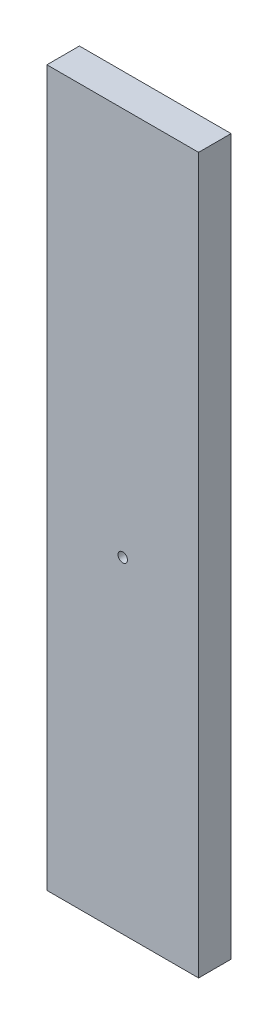
ISO-10303-21;
HEADER;
FILE_DESCRIPTION(('STEP AP214'),'2;1');
FILE_NAME('part.step','',(''),(''),'','','');
FILE_SCHEMA(('AUTOMOTIVE_DESIGN { 1 0 10303 214 1 1 1 1 }'));
ENDSEC;
DATA;
#1=APPLICATION_CONTEXT('core data for automotive mechanical design processes');
#2=APPLICATION_PROTOCOL_DEFINITION('international standard','automotive_design',2000,#1);
#3=PRODUCT_CONTEXT('',#1,'mechanical');
#4=PRODUCT('Part','Part','',(#3));
#5=PRODUCT_RELATED_PRODUCT_CATEGORY('part','',(#4));
#6=PRODUCT_DEFINITION_FORMATION('','',#4);
#7=PRODUCT_DEFINITION_CONTEXT('part definition',#1,'design');
#8=PRODUCT_DEFINITION('design','',#6,#7);
#9=PRODUCT_DEFINITION_SHAPE('','',#8);
#10=(LENGTH_UNIT() NAMED_UNIT(*) SI_UNIT(.MILLI.,.METRE.));
#11=(NAMED_UNIT(*) PLANE_ANGLE_UNIT() SI_UNIT($,.RADIAN.));
#12=(NAMED_UNIT(*) SI_UNIT($,.STERADIAN.) SOLID_ANGLE_UNIT());
#13=UNCERTAINTY_MEASURE_WITH_UNIT(LENGTH_MEASURE(1.E-05),#10,'distance_accuracy_value','');
#14=(GEOMETRIC_REPRESENTATION_CONTEXT(3) GLOBAL_UNCERTAINTY_ASSIGNED_CONTEXT((#13)) GLOBAL_UNIT_ASSIGNED_CONTEXT((#10,
#11,#12)) REPRESENTATION_CONTEXT('',''));
#15=CARTESIAN_POINT('',(0.,0.,0.));
#16=DIRECTION('',(0.,0.,1.));
#17=DIRECTION('',(1.,0.,0.));
#18=AXIS2_PLACEMENT_3D('',#15,#16,#17);
#19=CARTESIAN_POINT('',(0.,419.1,0.));
#20=DIRECTION('',(1.,0.,0.));
#21=DIRECTION('',(0.,0.,-1.));
#22=AXIS2_PLACEMENT_3D('',#19,#20,#21);
#23=PLANE('',#22);
#24=DIRECTION('',(0.,0.,1.));
#25=VECTOR('',#24,1.);
#26=CARTESIAN_POINT('',(0.,0.,0.));
#27=LINE('',#26,#25);
#28=CARTESIAN_POINT('',(0.,0.,-19.05));
#29=VERTEX_POINT('',#28);
#30=CARTESIAN_POINT('',(0.,0.,0.));
#31=VERTEX_POINT('',#30);
#32=EDGE_CURVE('E102',#29,#31,#27,.T.);
#33=ORIENTED_EDGE('',*,*,#32,.T.);
#34=DIRECTION('',(0.,-1.,0.));
#35=VECTOR('',#34,1.);
#36=CARTESIAN_POINT('',(0.,419.1,0.));
#37=LINE('',#36,#35);
#38=CARTESIAN_POINT('',(0.,419.1,0.));
#39=VERTEX_POINT('',#38);
#40=EDGE_CURVE('E11',#39,#31,#37,.T.);
#41=ORIENTED_EDGE('',*,*,#40,.F.);
#42=DIRECTION('',(0.,0.,1.));
#43=VECTOR('',#42,1.);
#44=CARTESIAN_POINT('',(0.,419.1,0.));
#45=LINE('',#44,#43);
#46=CARTESIAN_POINT('',(0.,419.1,-19.05));
#47=VERTEX_POINT('',#46);
#48=EDGE_CURVE('E90',#47,#39,#45,.T.);
#49=ORIENTED_EDGE('',*,*,#48,.F.);
#50=DIRECTION('',(0.,-1.,0.));
#51=VECTOR('',#50,1.);
#52=CARTESIAN_POINT('',(0.,419.1,-19.05));
#53=LINE('',#52,#51);
#54=EDGE_CURVE('E98',#47,#29,#53,.T.);
#55=ORIENTED_EDGE('',*,*,#54,.T.);
#56=EDGE_LOOP('',(#33,#41,#49,#55));
#57=FACE_BOUND('',#56,.T.);
#58=ADVANCED_FACE('F39',(#57),#23,.F.);
#59=CARTESIAN_POINT('',(0.,419.1,0.));
#60=DIRECTION('',(0.,0.,-1.));
#61=DIRECTION('',(-1.,0.,0.));
#62=AXIS2_PLACEMENT_3D('',#59,#60,#61);
#63=PLANE('',#62);
#64=CARTESIAN_POINT('',(44.45,191.301352372526,0.));
#65=DIRECTION('',(0.,0.,1.));
#66=DIRECTION('',(1.,0.,0.));
#67=AXIS2_PLACEMENT_3D('',#64,#65,#66);
#68=CIRCLE('',#67,2.77812500000003);
#69=CARTESIAN_POINT('',(47.228125,191.301352372526,0.));
#70=VERTEX_POINT('',#69);
#71=EDGE_CURVE('E116',#70,#70,#68,.T.);
#72=ORIENTED_EDGE('',*,*,#71,.F.);
#73=EDGE_LOOP('',(#72));
#74=FACE_BOUND('',#73,.T.);
#75=DIRECTION('',(1.,0.,0.));
#76=VECTOR('',#75,1.);
#77=CARTESIAN_POINT('',(0.,0.,0.));
#78=LINE('',#77,#76);
#79=CARTESIAN_POINT('',(88.9,0.,0.));
#80=VERTEX_POINT('',#79);
#81=EDGE_CURVE('E94',#31,#80,#78,.T.);
#82=ORIENTED_EDGE('',*,*,#81,.T.);
#83=DIRECTION('',(0.,-1.,0.));
#84=VECTOR('',#83,1.);
#85=CARTESIAN_POINT('',(88.9,419.1,0.));
#86=LINE('',#85,#84);
#87=CARTESIAN_POINT('',(88.9,419.1,0.));
#88=VERTEX_POINT('',#87);
#89=EDGE_CURVE('E47',#88,#80,#86,.T.);
#90=ORIENTED_EDGE('',*,*,#89,.F.);
#91=DIRECTION('',(1.,0.,0.));
#92=VECTOR('',#91,1.);
#93=CARTESIAN_POINT('',(0.,419.1,0.));
#94=LINE('',#93,#92);
#95=EDGE_CURVE('E85',#39,#88,#94,.T.);
#96=ORIENTED_EDGE('',*,*,#95,.F.);
#97=ORIENTED_EDGE('',*,*,#40,.T.);
#98=EDGE_LOOP('',(#82,#90,#96,#97));
#99=FACE_BOUND('',#98,.T.);
#100=ADVANCED_FACE('F93',(#74,#99),#63,.F.);
#101=CARTESIAN_POINT('',(88.9,419.1,0.));
#102=DIRECTION('',(-1.,0.,0.));
#103=DIRECTION('',(0.,0.,1.));
#104=AXIS2_PLACEMENT_3D('',#101,#102,#103);
#105=PLANE('',#104);
#106=DIRECTION('',(0.,0.,-1.));
#107=VECTOR('',#106,1.);
#108=CARTESIAN_POINT('',(88.9,0.,0.));
#109=LINE('',#108,#107);
#110=CARTESIAN_POINT('',(88.9,0.,-19.05));
#111=VERTEX_POINT('',#110);
#112=EDGE_CURVE('E72',#80,#111,#109,.T.);
#113=ORIENTED_EDGE('',*,*,#112,.T.);
#114=DIRECTION('',(0.,-1.,0.));
#115=VECTOR('',#114,1.);
#116=CARTESIAN_POINT('',(88.9,419.1,-19.05));
#117=LINE('',#116,#115);
#118=CARTESIAN_POINT('',(88.9,419.1,-19.05));
#119=VERTEX_POINT('',#118);
#120=EDGE_CURVE('E95',#119,#111,#117,.T.);
#121=ORIENTED_EDGE('',*,*,#120,.F.);
#122=DIRECTION('',(0.,0.,-1.));
#123=VECTOR('',#122,1.);
#124=CARTESIAN_POINT('',(88.9,419.1,0.));
#125=LINE('',#124,#123);
#126=EDGE_CURVE('E88',#88,#119,#125,.T.);
#127=ORIENTED_EDGE('',*,*,#126,.F.);
#128=ORIENTED_EDGE('',*,*,#89,.T.);
#129=EDGE_LOOP('',(#113,#121,#127,#128));
#130=FACE_BOUND('',#129,.T.);
#131=ADVANCED_FACE('F96',(#130),#105,.F.);
#132=CARTESIAN_POINT('',(0.,419.1,-19.05));
#133=DIRECTION('',(0.,0.,1.));
#134=DIRECTION('',(1.,0.,0.));
#135=AXIS2_PLACEMENT_3D('',#132,#133,#134);
#136=PLANE('',#135);
#137=CARTESIAN_POINT('',(44.45,191.301352372526,-19.05));
#138=DIRECTION('',(0.,0.,1.));
#139=DIRECTION('',(1.,0.,0.));
#140=AXIS2_PLACEMENT_3D('',#137,#138,#139);
#141=CIRCLE('',#140,2.77812500000003);
#142=CARTESIAN_POINT('',(47.228125,191.301352372526,-19.05));
#143=VERTEX_POINT('',#142);
#144=EDGE_CURVE('E105',#143,#143,#141,.T.);
#145=ORIENTED_EDGE('',*,*,#144,.T.);
#146=EDGE_LOOP('',(#145));
#147=FACE_BOUND('',#146,.T.);
#148=DIRECTION('',(-1.,0.,0.));
#149=VECTOR('',#148,1.);
#150=CARTESIAN_POINT('',(0.,0.,-19.05));
#151=LINE('',#150,#149);
#152=EDGE_CURVE('E78',#111,#29,#151,.T.);
#153=ORIENTED_EDGE('',*,*,#152,.T.);
#154=ORIENTED_EDGE('',*,*,#54,.F.);
#155=DIRECTION('',(-1.,0.,0.));
#156=VECTOR('',#155,1.);
#157=CARTESIAN_POINT('',(0.,419.1,-19.05));
#158=LINE('',#157,#156);
#159=EDGE_CURVE('E55',#119,#47,#158,.T.);
#160=ORIENTED_EDGE('',*,*,#159,.F.);
#161=ORIENTED_EDGE('',*,*,#120,.T.);
#162=EDGE_LOOP('',(#153,#154,#160,#161));
#163=FACE_BOUND('',#162,.T.);
#164=ADVANCED_FACE('F110',(#147,#163),#136,.F.);
#165=CARTESIAN_POINT('',(0.,419.1,0.));
#166=DIRECTION('',(0.,-1.,0.));
#167=DIRECTION('',(0.,0.,-1.));
#168=AXIS2_PLACEMENT_3D('',#165,#166,#167);
#169=PLANE('',#168);
#170=ORIENTED_EDGE('',*,*,#48,.T.);
#171=ORIENTED_EDGE('',*,*,#95,.T.);
#172=ORIENTED_EDGE('',*,*,#126,.T.);
#173=ORIENTED_EDGE('',*,*,#159,.T.);
#174=EDGE_LOOP('',(#170,#171,#172,#173));
#175=FACE_BOUND('',#174,.T.);
#176=ADVANCED_FACE('F86',(#175),#169,.F.);
#177=CARTESIAN_POINT('',(0.,0.,0.));
#178=DIRECTION('',(0.,-1.,0.));
#179=DIRECTION('',(0.,0.,-1.));
#180=AXIS2_PLACEMENT_3D('',#177,#178,#179);
#181=PLANE('',#180);
#182=ORIENTED_EDGE('',*,*,#32,.F.);
#183=ORIENTED_EDGE('',*,*,#152,.F.);
#184=ORIENTED_EDGE('',*,*,#112,.F.);
#185=ORIENTED_EDGE('',*,*,#81,.F.);
#186=EDGE_LOOP('',(#182,#183,#184,#185));
#187=FACE_BOUND('',#186,.T.);
#188=ADVANCED_FACE('F113',(#187),#181,.T.);
#189=CARTESIAN_POINT('',(44.45,191.301352372526,-19.05));
#190=DIRECTION('',(0.,0.,1.));
#191=DIRECTION('',(1.,0.,0.));
#192=AXIS2_PLACEMENT_3D('',#189,#190,#191);
#193=CYLINDRICAL_SURFACE('',#192,2.77812500000003);
#194=CARTESIAN_POINT('',(47.228125,191.301352372526,-19.05));
#195=CARTESIAN_POINT('',(47.228125,191.301352372526,-18.8515625));
#196=CARTESIAN_POINT('',(47.228125,191.301352372526,-18.653125));
#197=CARTESIAN_POINT('',(47.228125,191.301352372526,-18.25625));
#198=CARTESIAN_POINT('',(47.228125,191.301352372526,-18.0578125));
#199=CARTESIAN_POINT('',(47.228125,191.301352372526,-17.6609375));
#200=CARTESIAN_POINT('',(47.228125,191.301352372526,-17.4625));
#201=CARTESIAN_POINT('',(47.228125,191.301352372526,-17.065625));
#202=CARTESIAN_POINT('',(47.228125,191.301352372526,-16.8671875));
#203=CARTESIAN_POINT('',(47.228125,191.301352372526,-16.4703125));
#204=CARTESIAN_POINT('',(47.228125,191.301352372526,-16.271875));
#205=CARTESIAN_POINT('',(47.228125,191.301352372526,-15.875));
#206=CARTESIAN_POINT('',(47.228125,191.301352372526,-15.6765625));
#207=CARTESIAN_POINT('',(47.228125,191.301352372526,-15.2796875));
#208=CARTESIAN_POINT('',(47.228125,191.301352372526,-15.08125));
#209=CARTESIAN_POINT('',(47.228125,191.301352372526,-14.684375));
#210=CARTESIAN_POINT('',(47.228125,191.301352372526,-14.4859375));
#211=CARTESIAN_POINT('',(47.228125,191.301352372526,-14.0890625));
#212=CARTESIAN_POINT('',(47.228125,191.301352372526,-13.890625));
#213=CARTESIAN_POINT('',(47.228125,191.301352372526,-13.49375));
#214=CARTESIAN_POINT('',(47.228125,191.301352372526,-13.2953125));
#215=CARTESIAN_POINT('',(47.228125,191.301352372526,-12.8984375));
#216=CARTESIAN_POINT('',(47.228125,191.301352372526,-12.7));
#217=CARTESIAN_POINT('',(47.228125,191.301352372526,-12.303125));
#218=CARTESIAN_POINT('',(47.228125,191.301352372526,-12.1046875));
#219=CARTESIAN_POINT('',(47.228125,191.301352372526,-11.7078125));
#220=CARTESIAN_POINT('',(47.228125,191.301352372526,-11.509375));
#221=CARTESIAN_POINT('',(47.228125,191.301352372526,-11.1125));
#222=CARTESIAN_POINT('',(47.228125,191.301352372526,-10.9140625));
#223=CARTESIAN_POINT('',(47.228125,191.301352372526,-10.5171875));
#224=CARTESIAN_POINT('',(47.228125,191.301352372526,-10.31875));
#225=CARTESIAN_POINT('',(47.228125,191.301352372526,-9.921875));
#226=CARTESIAN_POINT('',(47.228125,191.301352372526,-9.7234375));
#227=CARTESIAN_POINT('',(47.228125,191.301352372526,-9.3265625));
#228=CARTESIAN_POINT('',(47.228125,191.301352372526,-9.128125));
#229=CARTESIAN_POINT('',(47.228125,191.301352372526,-8.73125));
#230=CARTESIAN_POINT('',(47.228125,191.301352372526,-8.5328125));
#231=CARTESIAN_POINT('',(47.228125,191.301352372526,-8.1359375));
#232=CARTESIAN_POINT('',(47.228125,191.301352372526,-7.9375));
#233=CARTESIAN_POINT('',(47.228125,191.301352372526,-7.540625));
#234=CARTESIAN_POINT('',(47.228125,191.301352372526,-7.3421875));
#235=CARTESIAN_POINT('',(47.228125,191.301352372526,-6.9453125));
#236=CARTESIAN_POINT('',(47.228125,191.301352372526,-6.746875));
#237=CARTESIAN_POINT('',(47.228125,191.301352372526,-6.35));
#238=CARTESIAN_POINT('',(47.228125,191.301352372526,-6.1515625));
#239=CARTESIAN_POINT('',(47.228125,191.301352372526,-5.7546875));
#240=CARTESIAN_POINT('',(47.228125,191.301352372526,-5.55625));
#241=CARTESIAN_POINT('',(47.228125,191.301352372526,-5.159375));
#242=CARTESIAN_POINT('',(47.228125,191.301352372526,-4.9609375));
#243=CARTESIAN_POINT('',(47.228125,191.301352372526,-4.5640625));
#244=CARTESIAN_POINT('',(47.228125,191.301352372526,-4.365625));
#245=CARTESIAN_POINT('',(47.228125,191.301352372526,-3.96875));
#246=CARTESIAN_POINT('',(47.228125,191.301352372526,-3.7703125));
#247=CARTESIAN_POINT('',(47.228125,191.301352372526,-3.3734375));
#248=CARTESIAN_POINT('',(47.228125,191.301352372526,-3.175));
#249=CARTESIAN_POINT('',(47.228125,191.301352372526,-2.778125));
#250=CARTESIAN_POINT('',(47.228125,191.301352372526,-2.5796875));
#251=CARTESIAN_POINT('',(47.228125,191.301352372526,-2.1828125));
#252=CARTESIAN_POINT('',(47.228125,191.301352372526,-1.984375));
#253=CARTESIAN_POINT('',(47.228125,191.301352372526,-1.5875));
#254=CARTESIAN_POINT('',(47.228125,191.301352372526,-1.3890625));
#255=CARTESIAN_POINT('',(47.228125,191.301352372526,-0.992187500000001));
#256=CARTESIAN_POINT('',(47.228125,191.301352372526,-0.793750000000001));
#257=CARTESIAN_POINT('',(47.228125,191.301352372526,-0.396875));
#258=CARTESIAN_POINT('',(47.228125,191.301352372526,-0.1984375));
#259=CARTESIAN_POINT('',(47.228125,191.301352372526,0.));
#260=B_SPLINE_CURVE_WITH_KNOTS('',3,(#194,#195,#196,#197,#198,#199,#200,#201,#202,#203,#204,
#205,#206,#207,#208,#209,#210,#211,#212,#213,#214,#215,#216,#217,#218,#219,#220,#221,#222,#223,
#224,#225,#226,#227,#228,#229,#230,#231,#232,#233,#234,#235,#236,#237,#238,#239,#240,#241,#242,
#243,#244,#245,#246,#247,#248,#249,#250,#251,#252,#253,#254,#255,#256,#257,#258,#259),
.UNSPECIFIED.,.F.,.F.,(4,2,2,2,2,2,2,2,2,2,2,2,2,2,2,2,2,2,2,2,2,2,2,2,2,2,2,2,2,2,2,2,4),(0.,
0.5953125,1.190625,1.7859375,2.38125,2.9765625,3.571875,4.1671875,4.7625,5.3578125,5.953125,
6.5484375,7.14375,7.7390625,8.334375,8.9296875,9.525,10.1203125,10.715625,11.3109375,11.90625,
12.5015625,13.096875,13.6921875,14.2875,14.8828125,15.478125,16.0734375,16.66875,17.2640625,
17.859375,18.4546875,19.05),.UNSPECIFIED.);
#261=EDGE_CURVE('BSEAM123',#143,#70,#260,.T.);
#262=ORIENTED_EDGE('',*,*,#144,.F.);
#263=ORIENTED_EDGE('',*,*,#71,.T.);
#264=ORIENTED_EDGE('',*,*,#261,.T.);
#265=ORIENTED_EDGE('',*,*,#261,.F.);
#266=EDGE_LOOP('',(#262,#264,#263,#265));
#267=FACE_BOUND('',#266,.T.);
#268=ADVANCED_FACE('F123',(#267),#193,.F.);
#269=CLOSED_SHELL('',(#58,#100,#131,#164,#176,#188,#268));
#270=MANIFOLD_SOLID_BREP('B2',#269);
#271=ADVANCED_BREP_SHAPE_REPRESENTATION('',(#18,#270),#14);
#272=SHAPE_DEFINITION_REPRESENTATION(#9,#271);
ENDSEC;
END-ISO-10303-21;
